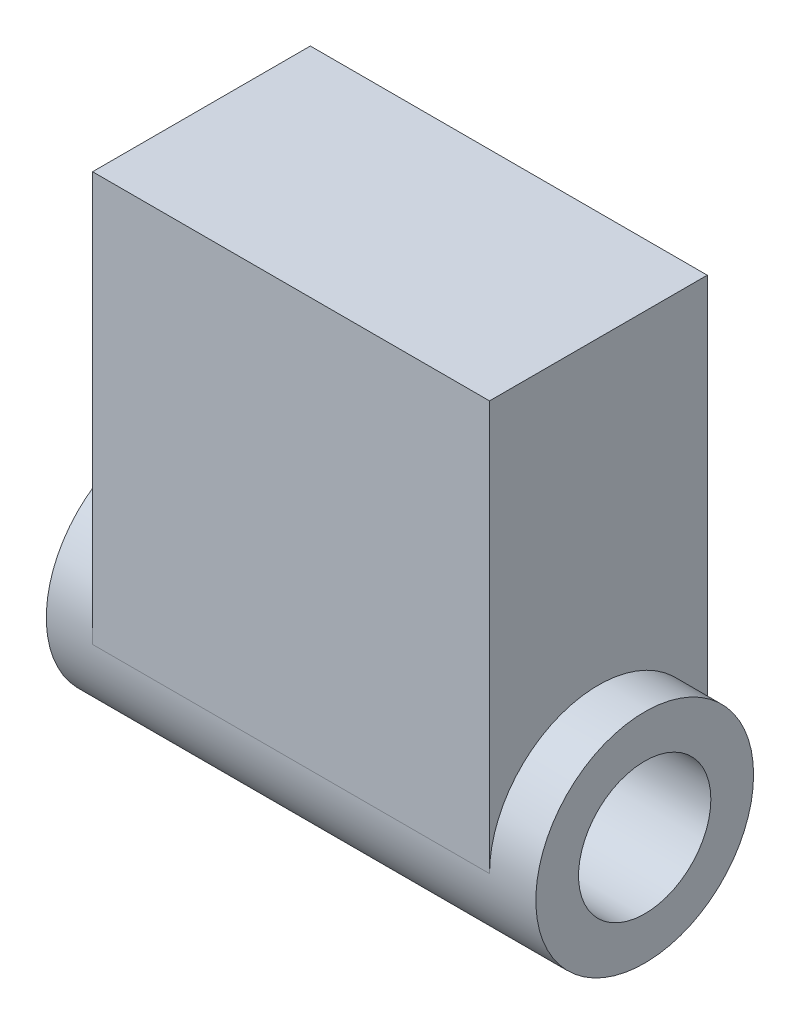
ISO-10303-21;
HEADER;
FILE_DESCRIPTION(('STEP AP214'),'2;1');
FILE_NAME('part.step','',(''),(''),'','','');
FILE_SCHEMA(('AUTOMOTIVE_DESIGN { 1 0 10303 214 1 1 1 1 }'));
ENDSEC;
DATA;
#1=APPLICATION_CONTEXT('core data for automotive mechanical design processes');
#2=APPLICATION_PROTOCOL_DEFINITION('international standard','automotive_design',2000,#1);
#3=PRODUCT_CONTEXT('',#1,'mechanical');
#4=PRODUCT('Part','Part','',(#3));
#5=PRODUCT_RELATED_PRODUCT_CATEGORY('part','',(#4));
#6=PRODUCT_DEFINITION_FORMATION('','',#4);
#7=PRODUCT_DEFINITION_CONTEXT('part definition',#1,'design');
#8=PRODUCT_DEFINITION('design','',#6,#7);
#9=PRODUCT_DEFINITION_SHAPE('','',#8);
#10=(LENGTH_UNIT() NAMED_UNIT(*) SI_UNIT(.MILLI.,.METRE.));
#11=(NAMED_UNIT(*) PLANE_ANGLE_UNIT() SI_UNIT($,.RADIAN.));
#12=(NAMED_UNIT(*) SI_UNIT($,.STERADIAN.) SOLID_ANGLE_UNIT());
#13=UNCERTAINTY_MEASURE_WITH_UNIT(LENGTH_MEASURE(1.E-05),#10,'distance_accuracy_value','');
#14=(GEOMETRIC_REPRESENTATION_CONTEXT(3) GLOBAL_UNCERTAINTY_ASSIGNED_CONTEXT((#13)) GLOBAL_UNIT_ASSIGNED_CONTEXT((#10,
#11,#12)) REPRESENTATION_CONTEXT('',''));
#15=CARTESIAN_POINT('',(0.,0.,0.));
#16=DIRECTION('',(0.,0.,1.));
#17=DIRECTION('',(1.,0.,0.));
#18=AXIS2_PLACEMENT_3D('',#15,#16,#17);
#19=CARTESIAN_POINT('',(7.4,0.,0.));
#20=DIRECTION('',(-1.,0.,0.));
#21=DIRECTION('',(0.,0.,1.));
#22=AXIS2_PLACEMENT_3D('',#19,#20,#21);
#23=CYLINDRICAL_SURFACE('',#22,2.);
#24=CARTESIAN_POINT('',(7.4,0.,0.));
#25=DIRECTION('',(1.,0.,0.));
#26=DIRECTION('',(0.,0.,-1.));
#27=AXIS2_PLACEMENT_3D('',#24,#25,#26);
#28=CIRCLE('',#27,2.);
#29=CARTESIAN_POINT('',(7.4,0.,-2.));
#30=VERTEX_POINT('',#29);
#31=EDGE_CURVE('E43',#30,#30,#28,.T.);
#32=ORIENTED_EDGE('',*,*,#31,.T.);
#33=EDGE_LOOP('',(#32));
#34=FACE_BOUND('',#33,.T.);
#35=CARTESIAN_POINT('',(-7.4,0.,0.));
#36=DIRECTION('',(1.,0.,0.));
#37=DIRECTION('',(0.,0.,-1.));
#38=AXIS2_PLACEMENT_3D('',#35,#36,#37);
#39=CIRCLE('',#38,2.);
#40=CARTESIAN_POINT('',(-7.4,0.,-2.));
#41=VERTEX_POINT('',#40);
#42=EDGE_CURVE('E113',#41,#41,#39,.T.);
#43=ORIENTED_EDGE('',*,*,#42,.F.);
#44=EDGE_LOOP('',(#43));
#45=FACE_BOUND('',#44,.T.);
#46=ADVANCED_FACE('F35',(#34,#45),#23,.F.);
#47=CARTESIAN_POINT('',(7.4,0.,0.));
#48=DIRECTION('',(-1.,0.,0.));
#49=DIRECTION('',(0.,0.,1.));
#50=AXIS2_PLACEMENT_3D('',#47,#48,#49);
#51=CYLINDRICAL_SURFACE('',#50,3.29135807388907);
#52=DIRECTION('',(-1.,0.,0.));
#53=VECTOR('',#52,1.);
#54=CARTESIAN_POINT('',(6.,0.,-3.29135807388907));
#55=LINE('',#54,#53);
#56=CARTESIAN_POINT('',(6.,0.,-3.29135807388907));
#57=VERTEX_POINT('',#56);
#58=CARTESIAN_POINT('',(-6.,0.,-3.29135807388907));
#59=VERTEX_POINT('',#58);
#60=EDGE_CURVE('E51',#57,#59,#55,.T.);
#61=ORIENTED_EDGE('',*,*,#60,.F.);
#62=CARTESIAN_POINT('',(6.,0.,0.));
#63=DIRECTION('',(1.,0.,0.));
#64=DIRECTION('',(0.,0.,-1.));
#65=AXIS2_PLACEMENT_3D('',#62,#63,#64);
#66=CIRCLE('',#65,3.29135807388907);
#67=CARTESIAN_POINT('',(6.,0.,3.29135807388907));
#68=VERTEX_POINT('',#67);
#69=EDGE_CURVE('E55',#57,#68,#66,.T.);
#70=ORIENTED_EDGE('',*,*,#69,.T.);
#71=DIRECTION('',(-1.,0.,0.));
#72=VECTOR('',#71,1.);
#73=CARTESIAN_POINT('',(6.,0.,3.29135807388907));
#74=LINE('',#73,#72);
#75=CARTESIAN_POINT('',(-6.,0.,3.29135807388907));
#76=VERTEX_POINT('',#75);
#77=EDGE_CURVE('E97',#68,#76,#74,.T.);
#78=ORIENTED_EDGE('',*,*,#77,.T.);
#79=CARTESIAN_POINT('',(-6.,0.,0.));
#80=DIRECTION('',(1.,0.,0.));
#81=DIRECTION('',(0.,0.,-1.));
#82=AXIS2_PLACEMENT_3D('',#79,#80,#81);
#83=CIRCLE('',#82,3.29135807388907);
#84=EDGE_CURVE('E101',#59,#76,#83,.T.);
#85=ORIENTED_EDGE('',*,*,#84,.F.);
#86=EDGE_LOOP('',(#61,#70,#78,#85));
#87=FACE_BOUND('',#86,.T.);
#88=CARTESIAN_POINT('',(7.4,0.,0.));
#89=DIRECTION('',(1.,0.,0.));
#90=DIRECTION('',(0.,0.,-1.));
#91=AXIS2_PLACEMENT_3D('',#88,#89,#90);
#92=CIRCLE('',#91,3.29135807388907);
#93=CARTESIAN_POINT('',(7.4,0.,-3.29135807388907));
#94=VERTEX_POINT('',#93);
#95=EDGE_CURVE('E11',#94,#94,#92,.T.);
#96=ORIENTED_EDGE('',*,*,#95,.F.);
#97=EDGE_LOOP('',(#96));
#98=FACE_BOUND('',#97,.T.);
#99=CARTESIAN_POINT('',(-7.4,0.,0.));
#100=DIRECTION('',(1.,0.,0.));
#101=DIRECTION('',(0.,0.,-1.));
#102=AXIS2_PLACEMENT_3D('',#99,#100,#101);
#103=CIRCLE('',#102,3.29135807388907);
#104=CARTESIAN_POINT('',(-7.4,0.,-3.29135807388907));
#105=VERTEX_POINT('',#104);
#106=EDGE_CURVE('E38',#105,#105,#103,.T.);
#107=ORIENTED_EDGE('',*,*,#106,.T.);
#108=EDGE_LOOP('',(#107));
#109=FACE_BOUND('',#108,.T.);
#110=ADVANCED_FACE('F121',(#87,#98,#109),#51,.T.);
#111=CARTESIAN_POINT('',(7.4,0.,0.));
#112=DIRECTION('',(1.,0.,0.));
#113=DIRECTION('',(0.,0.,-1.));
#114=AXIS2_PLACEMENT_3D('',#111,#112,#113);
#115=PLANE('',#114);
#116=ORIENTED_EDGE('',*,*,#31,.F.);
#117=EDGE_LOOP('',(#116));
#118=FACE_BOUND('',#117,.T.);
#119=ORIENTED_EDGE('',*,*,#95,.T.);
#120=EDGE_LOOP('',(#119));
#121=FACE_BOUND('',#120,.T.);
#122=ADVANCED_FACE('F125',(#118,#121),#115,.T.);
#123=CARTESIAN_POINT('',(-7.4,0.,0.));
#124=DIRECTION('',(1.,0.,0.));
#125=DIRECTION('',(0.,0.,-1.));
#126=AXIS2_PLACEMENT_3D('',#123,#124,#125);
#127=PLANE('',#126);
#128=ORIENTED_EDGE('',*,*,#42,.T.);
#129=EDGE_LOOP('',(#128));
#130=FACE_BOUND('',#129,.T.);
#131=ORIENTED_EDGE('',*,*,#106,.F.);
#132=EDGE_LOOP('',(#131));
#133=FACE_BOUND('',#132,.T.);
#134=ADVANCED_FACE('F123',(#130,#133),#127,.F.);
#135=CARTESIAN_POINT('',(6.,0.,-3.29135807388907));
#136=DIRECTION('',(0.,0.,-1.));
#137=DIRECTION('',(-1.,0.,0.));
#138=AXIS2_PLACEMENT_3D('',#135,#136,#137);
#139=PLANE('',#138);
#140=DIRECTION('',(0.,-1.,0.));
#141=VECTOR('',#140,1.);
#142=CARTESIAN_POINT('',(-6.,0.,-3.29135807388907));
#143=LINE('',#142,#141);
#144=CARTESIAN_POINT('',(-6.,12.3765481092871,-3.29135807388907));
#145=VERTEX_POINT('',#144);
#146=EDGE_CURVE('E80',#145,#59,#143,.T.);
#147=ORIENTED_EDGE('',*,*,#146,.F.);
#148=DIRECTION('',(-1.,0.,0.));
#149=VECTOR('',#148,1.);
#150=CARTESIAN_POINT('',(6.,12.3765481092871,-3.29135807388907));
#151=LINE('',#150,#149);
#152=CARTESIAN_POINT('',(6.,12.3765481092871,-3.29135807388907));
#153=VERTEX_POINT('',#152);
#154=EDGE_CURVE('E75',#153,#145,#151,.T.);
#155=ORIENTED_EDGE('',*,*,#154,.F.);
#156=DIRECTION('',(0.,-1.,0.));
#157=VECTOR('',#156,1.);
#158=CARTESIAN_POINT('',(6.,0.,-3.29135807388907));
#159=LINE('',#158,#157);
#160=EDGE_CURVE('E78',#153,#57,#159,.T.);
#161=ORIENTED_EDGE('',*,*,#160,.T.);
#162=ORIENTED_EDGE('',*,*,#60,.T.);
#163=EDGE_LOOP('',(#147,#155,#161,#162));
#164=FACE_BOUND('',#163,.T.);
#165=ADVANCED_FACE('F77',(#164),#139,.T.);
#166=CARTESIAN_POINT('',(6.,12.3765481092871,0.));
#167=DIRECTION('',(0.,1.,0.));
#168=DIRECTION('',(0.,0.,1.));
#169=AXIS2_PLACEMENT_3D('',#166,#167,#168);
#170=PLANE('',#169);
#171=DIRECTION('',(0.,0.,-1.));
#172=VECTOR('',#171,1.);
#173=CARTESIAN_POINT('',(-6.,12.3765481092871,0.));
#174=LINE('',#173,#172);
#175=CARTESIAN_POINT('',(-6.,12.3765481092871,3.29135807388907));
#176=VERTEX_POINT('',#175);
#177=EDGE_CURVE('E105',#176,#145,#174,.T.);
#178=ORIENTED_EDGE('',*,*,#177,.F.);
#179=DIRECTION('',(-1.,0.,0.));
#180=VECTOR('',#179,1.);
#181=CARTESIAN_POINT('',(6.,12.3765481092871,3.29135807388907));
#182=LINE('',#181,#180);
#183=CARTESIAN_POINT('',(6.,12.3765481092871,3.29135807388907));
#184=VERTEX_POINT('',#183);
#185=EDGE_CURVE('E85',#184,#176,#182,.T.);
#186=ORIENTED_EDGE('',*,*,#185,.F.);
#187=DIRECTION('',(0.,0.,-1.));
#188=VECTOR('',#187,1.);
#189=CARTESIAN_POINT('',(6.,12.3765481092871,0.));
#190=LINE('',#189,#188);
#191=EDGE_CURVE('E91',#184,#153,#190,.T.);
#192=ORIENTED_EDGE('',*,*,#191,.T.);
#193=ORIENTED_EDGE('',*,*,#154,.T.);
#194=EDGE_LOOP('',(#178,#186,#192,#193));
#195=FACE_BOUND('',#194,.T.);
#196=ADVANCED_FACE('F94',(#195),#170,.T.);
#197=CARTESIAN_POINT('',(6.,0.,3.29135807388907));
#198=DIRECTION('',(0.,0.,1.));
#199=DIRECTION('',(1.,0.,0.));
#200=AXIS2_PLACEMENT_3D('',#197,#198,#199);
#201=PLANE('',#200);
#202=DIRECTION('',(0.,1.,0.));
#203=VECTOR('',#202,1.);
#204=CARTESIAN_POINT('',(-6.,0.,3.29135807388907));
#205=LINE('',#204,#203);
#206=EDGE_CURVE('E107',#76,#176,#205,.T.);
#207=ORIENTED_EDGE('',*,*,#206,.F.);
#208=ORIENTED_EDGE('',*,*,#77,.F.);
#209=DIRECTION('',(0.,1.,0.));
#210=VECTOR('',#209,1.);
#211=CARTESIAN_POINT('',(6.,0.,3.29135807388907));
#212=LINE('',#211,#210);
#213=EDGE_CURVE('E95',#68,#184,#212,.T.);
#214=ORIENTED_EDGE('',*,*,#213,.T.);
#215=ORIENTED_EDGE('',*,*,#185,.T.);
#216=EDGE_LOOP('',(#207,#208,#214,#215));
#217=FACE_BOUND('',#216,.T.);
#218=ADVANCED_FACE('F171',(#217),#201,.T.);
#219=CARTESIAN_POINT('',(6.,0.,0.));
#220=DIRECTION('',(1.,0.,0.));
#221=DIRECTION('',(0.,0.,-1.));
#222=AXIS2_PLACEMENT_3D('',#219,#220,#221);
#223=PLANE('',#222);
#224=ORIENTED_EDGE('',*,*,#69,.F.);
#225=ORIENTED_EDGE('',*,*,#160,.F.);
#226=ORIENTED_EDGE('',*,*,#191,.F.);
#227=ORIENTED_EDGE('',*,*,#213,.F.);
#228=EDGE_LOOP('',(#224,#225,#226,#227));
#229=FACE_BOUND('',#228,.T.);
#230=ADVANCED_FACE('F89',(#229),#223,.T.);
#231=CARTESIAN_POINT('',(-6.,0.,0.));
#232=DIRECTION('',(1.,0.,0.));
#233=DIRECTION('',(0.,0.,-1.));
#234=AXIS2_PLACEMENT_3D('',#231,#232,#233);
#235=PLANE('',#234);
#236=ORIENTED_EDGE('',*,*,#84,.T.);
#237=ORIENTED_EDGE('',*,*,#206,.T.);
#238=ORIENTED_EDGE('',*,*,#177,.T.);
#239=ORIENTED_EDGE('',*,*,#146,.T.);
#240=EDGE_LOOP('',(#236,#237,#238,#239));
#241=FACE_BOUND('',#240,.T.);
#242=ADVANCED_FACE('F187',(#241),#235,.F.);
#243=CLOSED_SHELL('',(#46,#110,#122,#134,#165,#196,#218,#230,#242));
#244=MANIFOLD_SOLID_BREP('B2',#243);
#245=ADVANCED_BREP_SHAPE_REPRESENTATION('',(#18,#244),#14);
#246=SHAPE_DEFINITION_REPRESENTATION(#9,#245);
ENDSEC;
END-ISO-10303-21;
